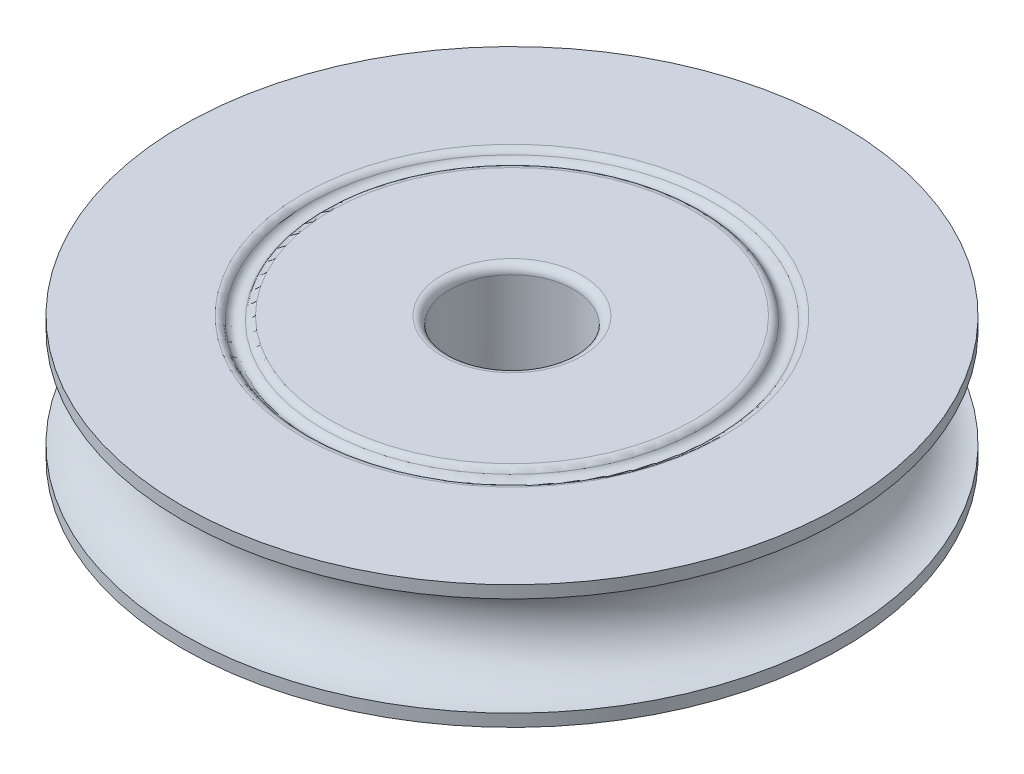
ISO-10303-21;
HEADER;
FILE_DESCRIPTION(('STEP AP214'),'2;1');
FILE_NAME('part.step','',(''),(''),'','','');
FILE_SCHEMA(('AUTOMOTIVE_DESIGN { 1 0 10303 214 1 1 1 1 }'));
ENDSEC;
DATA;
#1=APPLICATION_CONTEXT('core data for automotive mechanical design processes');
#2=APPLICATION_PROTOCOL_DEFINITION('international standard','automotive_design',2000,#1);
#3=PRODUCT_CONTEXT('',#1,'mechanical');
#4=PRODUCT('Part','Part','',(#3));
#5=PRODUCT_RELATED_PRODUCT_CATEGORY('part','',(#4));
#6=PRODUCT_DEFINITION_FORMATION('','',#4);
#7=PRODUCT_DEFINITION_CONTEXT('part definition',#1,'design');
#8=PRODUCT_DEFINITION('design','',#6,#7);
#9=PRODUCT_DEFINITION_SHAPE('','',#8);
#10=(LENGTH_UNIT() NAMED_UNIT(*) SI_UNIT(.MILLI.,.METRE.));
#11=(NAMED_UNIT(*) PLANE_ANGLE_UNIT() SI_UNIT($,.RADIAN.));
#12=(NAMED_UNIT(*) SI_UNIT($,.STERADIAN.) SOLID_ANGLE_UNIT());
#13=UNCERTAINTY_MEASURE_WITH_UNIT(LENGTH_MEASURE(1.E-05),#10,'distance_accuracy_value','');
#14=(GEOMETRIC_REPRESENTATION_CONTEXT(3) GLOBAL_UNCERTAINTY_ASSIGNED_CONTEXT((#13)) GLOBAL_UNIT_ASSIGNED_CONTEXT((#10,
#11,#12)) REPRESENTATION_CONTEXT('',''));
#15=CARTESIAN_POINT('',(0.,0.,0.));
#16=DIRECTION('',(0.,0.,1.));
#17=DIRECTION('',(1.,0.,0.));
#18=AXIS2_PLACEMENT_3D('',#15,#16,#17);
#19=CARTESIAN_POINT('',(0.,11.6985962082481,0.));
#20=DIRECTION('',(0.,1.,0.));
#21=DIRECTION('',(0.,0.,1.));
#22=AXIS2_PLACEMENT_3D('',#19,#20,#21);
#23=CYLINDRICAL_SURFACE('',#22,7.5);
#24=CARTESIAN_POINT('',(0.,-6.49999999999995,0.));
#25=DIRECTION('',(0.,-1.,0.));
#26=DIRECTION('',(0.,0.,-1.));
#27=AXIS2_PLACEMENT_3D('',#24,#25,#26);
#28=CIRCLE('',#27,7.5);
#29=CARTESIAN_POINT('',(0.,-6.49999999999993,-7.50000000000002));
#30=VERTEX_POINT('',#29);
#31=EDGE_CURVE('E37',#30,#30,#28,.T.);
#32=ORIENTED_EDGE('',*,*,#31,.T.);
#33=EDGE_LOOP('',(#32));
#34=FACE_BOUND('',#33,.T.);
#35=CARTESIAN_POINT('',(0.,6.50000000000005,0.));
#36=DIRECTION('',(0.,1.,0.));
#37=DIRECTION('',(0.,0.,1.));
#38=AXIS2_PLACEMENT_3D('',#35,#36,#37);
#39=CIRCLE('',#38,7.5);
#40=CARTESIAN_POINT('',(0.,6.50000000000003,7.50000000000002));
#41=VERTEX_POINT('',#40);
#42=EDGE_CURVE('E41',#41,#41,#39,.T.);
#43=ORIENTED_EDGE('',*,*,#42,.T.);
#44=EDGE_LOOP('',(#43));
#45=FACE_BOUND('',#44,.T.);
#46=ADVANCED_FACE('F30',(#34,#45),#23,.F.);
#47=CARTESIAN_POINT('',(0.,-7.49999999999997,7.5));
#48=DIRECTION('',(0.,-1.,0.));
#49=DIRECTION('',(0.,0.,-1.));
#50=AXIS2_PLACEMENT_3D('',#47,#48,#49);
#51=PLANE('',#50);
#52=CARTESIAN_POINT('',(0.,-7.49999999999995,0.));
#53=DIRECTION('',(0.,-1.,0.));
#54=DIRECTION('',(0.,0.,-1.));
#55=AXIS2_PLACEMENT_3D('',#52,#53,#54);
#56=CIRCLE('',#55,8.5);
#57=CARTESIAN_POINT('',(0.,-7.49999999999992,-8.50000000000003));
#58=VERTEX_POINT('',#57);
#59=EDGE_CURVE('E45',#58,#58,#56,.F.);
#60=ORIENTED_EDGE('',*,*,#59,.T.);
#61=EDGE_LOOP('',(#60));
#62=FACE_BOUND('',#61,.T.);
#63=CARTESIAN_POINT('',(0.,-7.49999999999995,0.));
#64=DIRECTION('',(0.,-1.,0.));
#65=DIRECTION('',(0.,0.,-1.));
#66=AXIS2_PLACEMENT_3D('',#63,#64,#65);
#67=CIRCLE('',#66,22.0179491924311);
#68=CARTESIAN_POINT('',(0.,-7.49999999999987,-22.0179491924312));
#69=VERTEX_POINT('',#68);
#70=EDGE_CURVE('E62',#69,#69,#67,.T.);
#71=ORIENTED_EDGE('',*,*,#70,.T.);
#72=EDGE_LOOP('',(#71));
#73=FACE_BOUND('',#72,.T.);
#74=ADVANCED_FACE('F105',(#62,#73),#51,.T.);
#75=CARTESIAN_POINT('',(0.,-7.49999999999992,0.));
#76=DIRECTION('',(0.,1.,0.));
#77=DIRECTION('',(0.,0.,1.));
#78=AXIS2_PLACEMENT_3D('',#75,#76,#77);
#79=TOROIDAL_SURFACE('',#78,23.75,1.);
#80=CARTESIAN_POINT('',(0.,-6.9999999999999,0.));
#81=DIRECTION('',(0.,-1.,0.));
#82=DIRECTION('',(0.,0.,-1.));
#83=AXIS2_PLACEMENT_3D('',#80,#81,#82);
#84=CIRCLE('',#83,24.6160254037845);
#85=CARTESIAN_POINT('',(0.,-6.99999999999982,-24.6160254037845));
#86=VERTEX_POINT('',#85);
#87=EDGE_CURVE('E65',#86,#86,#84,.T.);
#88=ORIENTED_EDGE('',*,*,#87,.T.);
#89=EDGE_LOOP('',(#88));
#90=FACE_BOUND('',#89,.T.);
#91=CARTESIAN_POINT('',(0.,-6.99999999999994,0.));
#92=DIRECTION('',(0.,-1.,0.));
#93=DIRECTION('',(0.,0.,-1.));
#94=AXIS2_PLACEMENT_3D('',#91,#92,#93);
#95=CIRCLE('',#94,22.8839745962156);
#96=CARTESIAN_POINT('',(0.,-6.99999999999986,-22.8839745962156));
#97=VERTEX_POINT('',#96);
#98=EDGE_CURVE('E68',#97,#97,#95,.F.);
#99=ORIENTED_EDGE('',*,*,#98,.T.);
#100=EDGE_LOOP('',(#99));
#101=FACE_BOUND('',#100,.T.);
#102=ADVANCED_FACE('F110',(#90,#101),#79,.F.);
#103=CARTESIAN_POINT('',(0.,-7.49999999999997,24.75));
#104=DIRECTION('',(0.,-1.,0.));
#105=DIRECTION('',(0.,0.,-1.));
#106=AXIS2_PLACEMENT_3D('',#103,#104,#105);
#107=PLANE('',#106);
#108=CARTESIAN_POINT('',(0.,-7.49999999999989,0.));
#109=DIRECTION('',(0.,-1.,0.));
#110=DIRECTION('',(0.,0.,-1.));
#111=AXIS2_PLACEMENT_3D('',#108,#109,#110);
#112=CIRCLE('',#111,25.4820508075689);
#113=CARTESIAN_POINT('',(0.,-7.4999999999998,-25.4820508075689));
#114=VERTEX_POINT('',#113);
#115=EDGE_CURVE('E71',#114,#114,#112,.F.);
#116=ORIENTED_EDGE('',*,*,#115,.T.);
#117=EDGE_LOOP('',(#116));
#118=FACE_BOUND('',#117,.T.);
#119=CARTESIAN_POINT('',(0.,-7.49999999999986,0.));
#120=DIRECTION('',(0.,1.,0.));
#121=DIRECTION('',(0.,0.,1.));
#122=AXIS2_PLACEMENT_3D('',#119,#120,#121);
#123=CIRCLE('',#122,40.);
#124=CARTESIAN_POINT('',(0.,-7.5,40.));
#125=VERTEX_POINT('',#124);
#126=EDGE_CURVE('E74',#125,#125,#123,.T.);
#127=ORIENTED_EDGE('',*,*,#126,.F.);
#128=EDGE_LOOP('',(#127));
#129=FACE_BOUND('',#128,.T.);
#130=ADVANCED_FACE('F147',(#118,#129),#107,.T.);
#131=CARTESIAN_POINT('',(0.,11.6985962082481,0.));
#132=DIRECTION('',(0.,1.,0.));
#133=DIRECTION('',(0.,0.,1.));
#134=AXIS2_PLACEMENT_3D('',#131,#132,#133);
#135=CYLINDRICAL_SURFACE('',#134,40.);
#136=ORIENTED_EDGE('',*,*,#126,.T.);
#137=EDGE_LOOP('',(#136));
#138=FACE_BOUND('',#137,.T.);
#139=CARTESIAN_POINT('',(0.,-5.99999999999986,0.));
#140=DIRECTION('',(0.,1.,0.));
#141=DIRECTION('',(0.,0.,1.));
#142=AXIS2_PLACEMENT_3D('',#139,#140,#141);
#143=CIRCLE('',#142,40.);
#144=CARTESIAN_POINT('',(0.,-6.,40.));
#145=VERTEX_POINT('',#144);
#146=EDGE_CURVE('E77',#145,#145,#143,.T.);
#147=ORIENTED_EDGE('',*,*,#146,.F.);
#148=EDGE_LOOP('',(#147));
#149=FACE_BOUND('',#148,.T.);
#150=ADVANCED_FACE('F101',(#138,#149),#135,.T.);
#151=CARTESIAN_POINT('',(0.,1.37043154602168E-13,0.));
#152=DIRECTION('',(0.,1.,0.));
#153=DIRECTION('',(0.,0.,1.));
#154=AXIS2_PLACEMENT_3D('',#151,#152,#153);
#155=TOROIDAL_SURFACE('',#154,40.,6.);
#156=ORIENTED_EDGE('',*,*,#146,.T.);
#157=EDGE_LOOP('',(#156));
#158=FACE_BOUND('',#157,.T.);
#159=CARTESIAN_POINT('',(0.,6.00000000000014,0.));
#160=DIRECTION('',(0.,1.,0.));
#161=DIRECTION('',(0.,0.,1.));
#162=AXIS2_PLACEMENT_3D('',#159,#160,#161);
#163=CIRCLE('',#162,40.);
#164=CARTESIAN_POINT('',(0.,6.,40.));
#165=VERTEX_POINT('',#164);
#166=EDGE_CURVE('E80',#165,#165,#163,.T.);
#167=ORIENTED_EDGE('',*,*,#166,.F.);
#168=EDGE_LOOP('',(#167));
#169=FACE_BOUND('',#168,.T.);
#170=ADVANCED_FACE('F91',(#158,#169),#155,.F.);
#171=CARTESIAN_POINT('',(0.,11.6985962082481,0.));
#172=DIRECTION('',(0.,1.,0.));
#173=DIRECTION('',(0.,0.,1.));
#174=AXIS2_PLACEMENT_3D('',#171,#172,#173);
#175=CYLINDRICAL_SURFACE('',#174,40.);
#176=ORIENTED_EDGE('',*,*,#166,.T.);
#177=EDGE_LOOP('',(#176));
#178=FACE_BOUND('',#177,.T.);
#179=CARTESIAN_POINT('',(0.,7.50000000000014,0.));
#180=DIRECTION('',(0.,1.,0.));
#181=DIRECTION('',(0.,0.,1.));
#182=AXIS2_PLACEMENT_3D('',#179,#180,#181);
#183=CIRCLE('',#182,40.);
#184=CARTESIAN_POINT('',(0.,7.5,40.));
#185=VERTEX_POINT('',#184);
#186=EDGE_CURVE('E83',#185,#185,#183,.T.);
#187=ORIENTED_EDGE('',*,*,#186,.F.);
#188=EDGE_LOOP('',(#187));
#189=FACE_BOUND('',#188,.T.);
#190=ADVANCED_FACE('F89',(#178,#189),#175,.T.);
#191=CARTESIAN_POINT('',(0.,7.49999999999997,40.));
#192=DIRECTION('',(0.,1.,0.));
#193=DIRECTION('',(0.,0.,1.));
#194=AXIS2_PLACEMENT_3D('',#191,#192,#193);
#195=PLANE('',#194);
#196=CARTESIAN_POINT('',(0.,7.50000000000011,0.));
#197=DIRECTION('',(0.,1.,0.));
#198=DIRECTION('',(0.,0.,1.));
#199=AXIS2_PLACEMENT_3D('',#196,#197,#198);
#200=CIRCLE('',#199,25.4820508075689);
#201=CARTESIAN_POINT('',(0.,7.50000000000002,25.4820508075689));
#202=VERTEX_POINT('',#201);
#203=EDGE_CURVE('E50',#202,#202,#200,.F.);
#204=ORIENTED_EDGE('',*,*,#203,.T.);
#205=EDGE_LOOP('',(#204));
#206=FACE_BOUND('',#205,.T.);
#207=ORIENTED_EDGE('',*,*,#186,.T.);
#208=EDGE_LOOP('',(#207));
#209=FACE_BOUND('',#208,.T.);
#210=ADVANCED_FACE('F87',(#206,#209),#195,.T.);
#211=CARTESIAN_POINT('',(0.,7.50000000000008,0.));
#212=DIRECTION('',(0.,1.,0.));
#213=DIRECTION('',(0.,0.,1.));
#214=AXIS2_PLACEMENT_3D('',#211,#212,#213);
#215=TOROIDAL_SURFACE('',#214,23.75,1.);
#216=CARTESIAN_POINT('',(0.,6.99999999999996,0.));
#217=DIRECTION('',(0.,1.,0.));
#218=DIRECTION('',(0.,0.,1.));
#219=AXIS2_PLACEMENT_3D('',#216,#217,#218);
#220=CIRCLE('',#219,22.8839745962154);
#221=CARTESIAN_POINT('',(0.,6.99999999999988,22.8839745962154));
#222=VERTEX_POINT('',#221);
#223=EDGE_CURVE('E53',#222,#222,#220,.F.);
#224=ORIENTED_EDGE('',*,*,#223,.T.);
#225=EDGE_LOOP('',(#224));
#226=FACE_BOUND('',#225,.T.);
#227=CARTESIAN_POINT('',(0.,7.00000000000007,0.));
#228=DIRECTION('',(0.,1.,0.));
#229=DIRECTION('',(0.,0.,1.));
#230=AXIS2_PLACEMENT_3D('',#227,#228,#229);
#231=CIRCLE('',#230,24.6160254037845);
#232=CARTESIAN_POINT('',(0.,6.99999999999998,24.6160254037845));
#233=VERTEX_POINT('',#232);
#234=EDGE_CURVE('E56',#233,#233,#231,.T.);
#235=ORIENTED_EDGE('',*,*,#234,.T.);
#236=EDGE_LOOP('',(#235));
#237=FACE_BOUND('',#236,.T.);
#238=ADVANCED_FACE('F98',(#226,#237),#215,.F.);
#239=CARTESIAN_POINT('',(0.,7.49999999999997,22.75));
#240=DIRECTION('',(0.,1.,0.));
#241=DIRECTION('',(0.,0.,1.));
#242=AXIS2_PLACEMENT_3D('',#239,#240,#241);
#243=PLANE('',#242);
#244=CARTESIAN_POINT('',(0.,7.50000000000005,0.));
#245=DIRECTION('',(0.,1.,0.));
#246=DIRECTION('',(0.,0.,1.));
#247=AXIS2_PLACEMENT_3D('',#244,#245,#246);
#248=CIRCLE('',#247,8.5);
#249=CARTESIAN_POINT('',(0.,7.50000000000002,8.50000000000003));
#250=VERTEX_POINT('',#249);
#251=EDGE_CURVE('E10',#250,#250,#248,.F.);
#252=ORIENTED_EDGE('',*,*,#251,.T.);
#253=EDGE_LOOP('',(#252));
#254=FACE_BOUND('',#253,.T.);
#255=CARTESIAN_POINT('',(0.,7.50000000000005,0.));
#256=DIRECTION('',(0.,1.,0.));
#257=DIRECTION('',(0.,0.,1.));
#258=AXIS2_PLACEMENT_3D('',#255,#256,#257);
#259=CIRCLE('',#258,22.0179491924311);
#260=CARTESIAN_POINT('',(0.,7.49999999999998,22.0179491924311));
#261=VERTEX_POINT('',#260);
#262=EDGE_CURVE('E59',#261,#261,#259,.T.);
#263=ORIENTED_EDGE('',*,*,#262,.T.);
#264=EDGE_LOOP('',(#263));
#265=FACE_BOUND('',#264,.T.);
#266=ADVANCED_FACE('F120',(#254,#265),#243,.T.);
#267=CARTESIAN_POINT('',(0.,-6.49999999999989,0.));
#268=DIRECTION('',(0.,-1.,0.));
#269=DIRECTION('',(0.,0.,-1.));
#270=AXIS2_PLACEMENT_3D('',#267,#268,#269);
#271=TOROIDAL_SURFACE('',#270,25.4820508075689,1.);
#272=ORIENTED_EDGE('',*,*,#87,.F.);
#273=EDGE_LOOP('',(#272));
#274=FACE_BOUND('',#273,.T.);
#275=ORIENTED_EDGE('',*,*,#115,.F.);
#276=EDGE_LOOP('',(#275));
#277=FACE_BOUND('',#276,.T.);
#278=ADVANCED_FACE('F116',(#274,#277),#271,.T.);
#279=CARTESIAN_POINT('',(0.,-6.49999999999995,0.));
#280=DIRECTION('',(0.,1.,0.));
#281=DIRECTION('',(0.,0.,1.));
#282=AXIS2_PLACEMENT_3D('',#279,#280,#281);
#283=TOROIDAL_SURFACE('',#282,22.0179491924311,1.);
#284=ORIENTED_EDGE('',*,*,#70,.F.);
#285=EDGE_LOOP('',(#284));
#286=FACE_BOUND('',#285,.T.);
#287=ORIENTED_EDGE('',*,*,#98,.F.);
#288=EDGE_LOOP('',(#287));
#289=FACE_BOUND('',#288,.T.);
#290=ADVANCED_FACE('F119',(#286,#289),#283,.T.);
#291=CARTESIAN_POINT('',(0.,6.50000000000005,0.));
#292=DIRECTION('',(0.,-1.,0.));
#293=DIRECTION('',(0.,0.,-1.));
#294=AXIS2_PLACEMENT_3D('',#291,#292,#293);
#295=TOROIDAL_SURFACE('',#294,22.0179491924311,1.);
#296=ORIENTED_EDGE('',*,*,#223,.F.);
#297=EDGE_LOOP('',(#296));
#298=FACE_BOUND('',#297,.T.);
#299=ORIENTED_EDGE('',*,*,#262,.F.);
#300=EDGE_LOOP('',(#299));
#301=FACE_BOUND('',#300,.T.);
#302=ADVANCED_FACE('F124',(#298,#301),#295,.T.);
#303=CARTESIAN_POINT('',(0.,6.50000000000011,0.));
#304=DIRECTION('',(0.,1.,0.));
#305=DIRECTION('',(0.,0.,1.));
#306=AXIS2_PLACEMENT_3D('',#303,#304,#305);
#307=TOROIDAL_SURFACE('',#306,25.4820508075689,1.);
#308=ORIENTED_EDGE('',*,*,#203,.F.);
#309=EDGE_LOOP('',(#308));
#310=FACE_BOUND('',#309,.T.);
#311=ORIENTED_EDGE('',*,*,#234,.F.);
#312=EDGE_LOOP('',(#311));
#313=FACE_BOUND('',#312,.T.);
#314=ADVANCED_FACE('F128',(#310,#313),#307,.T.);
#315=CARTESIAN_POINT('',(0.,-6.49999999999995,0.));
#316=DIRECTION('',(0.,-1.,0.));
#317=DIRECTION('',(0.,0.,-1.));
#318=AXIS2_PLACEMENT_3D('',#315,#316,#317);
#319=TOROIDAL_SURFACE('',#318,8.5,1.);
#320=ORIENTED_EDGE('',*,*,#31,.F.);
#321=EDGE_LOOP('',(#320));
#322=FACE_BOUND('',#321,.T.);
#323=ORIENTED_EDGE('',*,*,#59,.F.);
#324=EDGE_LOOP('',(#323));
#325=FACE_BOUND('',#324,.T.);
#326=ADVANCED_FACE('F131',(#322,#325),#319,.T.);
#327=CARTESIAN_POINT('',(0.,6.50000000000005,0.));
#328=DIRECTION('',(0.,1.,0.));
#329=DIRECTION('',(0.,0.,1.));
#330=AXIS2_PLACEMENT_3D('',#327,#328,#329);
#331=TOROIDAL_SURFACE('',#330,8.5,1.);
#332=ORIENTED_EDGE('',*,*,#251,.F.);
#333=EDGE_LOOP('',(#332));
#334=FACE_BOUND('',#333,.T.);
#335=ORIENTED_EDGE('',*,*,#42,.F.);
#336=EDGE_LOOP('',(#335));
#337=FACE_BOUND('',#336,.T.);
#338=ADVANCED_FACE('F32',(#334,#337),#331,.T.);
#339=CLOSED_SHELL('',(#46,#74,#102,#130,#150,#170,#190,#210,#238,#266,#278,#290,#302,#314,#326,#338));
#340=MANIFOLD_SOLID_BREP('B2',#339);
#341=ADVANCED_BREP_SHAPE_REPRESENTATION('',(#18,#340),#14);
#342=SHAPE_DEFINITION_REPRESENTATION(#9,#341);
ENDSEC;
END-ISO-10303-21;
